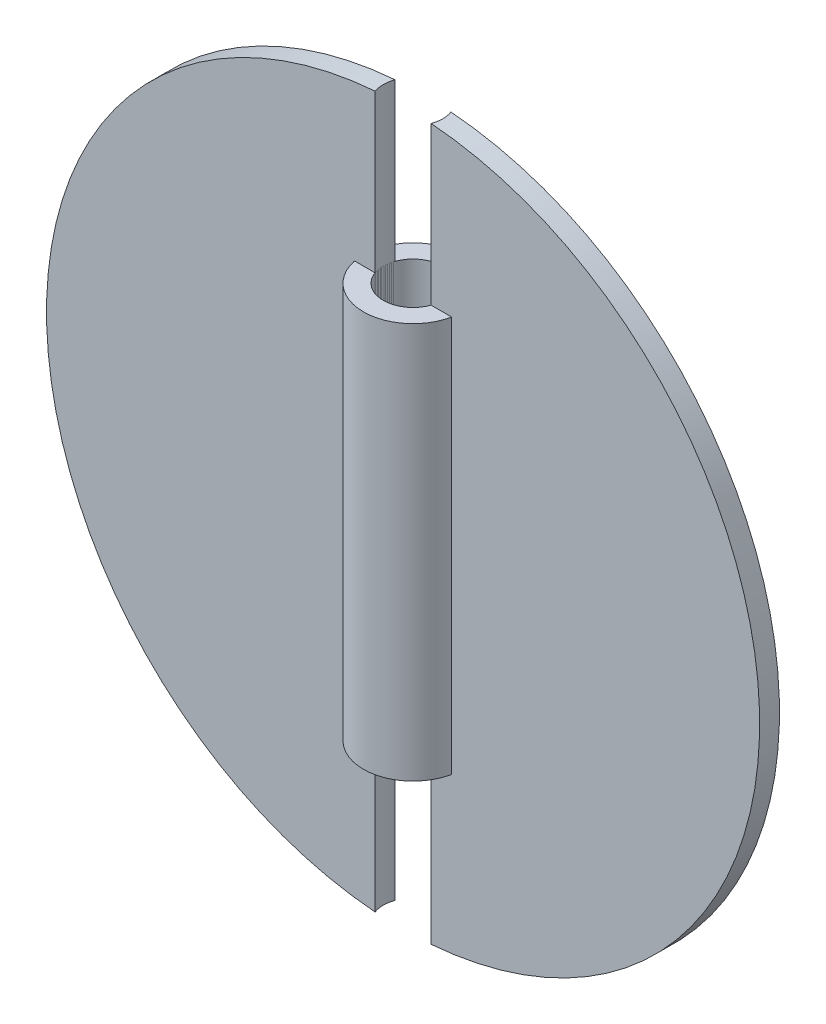
ISO-10303-21;
HEADER;
FILE_DESCRIPTION(('STEP AP214'),'2;1');
FILE_NAME('part.step','',(''),(''),'','','');
FILE_SCHEMA(('AUTOMOTIVE_DESIGN { 1 0 10303 214 1 1 1 1 }'));
ENDSEC;
DATA;
#1=APPLICATION_CONTEXT('core data for automotive mechanical design processes');
#2=APPLICATION_PROTOCOL_DEFINITION('international standard','automotive_design',2000,#1);
#3=PRODUCT_CONTEXT('',#1,'mechanical');
#4=PRODUCT('Part','Part','',(#3));
#5=PRODUCT_RELATED_PRODUCT_CATEGORY('part','',(#4));
#6=PRODUCT_DEFINITION_FORMATION('','',#4);
#7=PRODUCT_DEFINITION_CONTEXT('part definition',#1,'design');
#8=PRODUCT_DEFINITION('design','',#6,#7);
#9=PRODUCT_DEFINITION_SHAPE('','',#8);
#10=(LENGTH_UNIT() NAMED_UNIT(*) SI_UNIT(.MILLI.,.METRE.));
#11=(NAMED_UNIT(*) PLANE_ANGLE_UNIT() SI_UNIT($,.RADIAN.));
#12=(NAMED_UNIT(*) SI_UNIT($,.STERADIAN.) SOLID_ANGLE_UNIT());
#13=UNCERTAINTY_MEASURE_WITH_UNIT(LENGTH_MEASURE(1.E-05),#10,'distance_accuracy_value','');
#14=(GEOMETRIC_REPRESENTATION_CONTEXT(3) GLOBAL_UNCERTAINTY_ASSIGNED_CONTEXT((#13)) GLOBAL_UNIT_ASSIGNED_CONTEXT((#10,
#11,#12)) REPRESENTATION_CONTEXT('',''));
#15=CARTESIAN_POINT('',(0.,0.,0.));
#16=DIRECTION('',(0.,0.,1.));
#17=DIRECTION('',(1.,0.,0.));
#18=AXIS2_PLACEMENT_3D('',#15,#16,#17);
#19=CARTESIAN_POINT('',(0.,0.,2.));
#20=DIRECTION('',(0.,0.,-1.));
#21=DIRECTION('',(-1.,0.,0.));
#22=AXIS2_PLACEMENT_3D('',#19,#20,#21);
#23=CYLINDRICAL_SURFACE('',#22,36.);
#24=CARTESIAN_POINT('',(-2.82842712474619,-35.8887168898527,2.));
#25=CARTESIAN_POINT('',(-2.85685710321413,-35.8864742491253,1.91961725778914));
#26=CARTESIAN_POINT('',(-2.88184423251773,-35.8844729386396,1.83801039646096));
#27=CARTESIAN_POINT('',(-2.92478640735487,-35.8809995437341,1.67296300328552));
#28=CARTESIAN_POINT('',(-2.94274202966775,-35.8795274159074,1.58952262243114));
#29=CARTESIAN_POINT('',(-2.97107873749158,-35.8771916052031,1.42375391726264));
#30=CARTESIAN_POINT('',(-2.98165712639704,-35.8763120965818,1.34145949079588));
#31=CARTESIAN_POINT('',(-2.99596369777237,-35.8751202883122,1.1762752699752));
#32=CARTESIAN_POINT('',(-2.99969205131482,-35.8748079744986,1.0933854905415));
#33=CARTESIAN_POINT('',(-3.00027724030586,-35.8747590522023,0.925885201609564));
#34=CARTESIAN_POINT('',(-2.99699203862981,-35.8750343437651,0.841274157290855));
#35=CARTESIAN_POINT('',(-2.98328491449925,-35.8761767091872,0.67263165010222));
#36=CARTESIAN_POINT('',(-2.97286252929182,-35.8770438214184,0.58860022516988));
#37=CARTESIAN_POINT('',(-2.94454461758313,-35.8793795389662,0.419281579846612));
#38=CARTESIAN_POINT('',(-2.92643922061709,-35.8808650119824,0.334029627280769));
#39=CARTESIAN_POINT('',(-2.88289526145233,-35.884388648037,0.165426178952466));
#40=CARTESIAN_POINT('',(-2.8574562795393,-35.8864268427083,0.0820747922575321));
#41=CARTESIAN_POINT('',(-2.82842712474619,-35.8887168898527,0.));
#42=B_SPLINE_CURVE_WITH_KNOTS('',3,(#24,#25,#26,#27,#28,#29,#30,#31,#32,#33,#34,#35,#36,#37,#38,
#39,#40,#41),.UNSPECIFIED.,.F.,.F.,(4,2,2,2,2,2,2,2,4),(0.,0.255797873824147,0.511574760703559,
0.760217392738763,1.00885381509623,1.2625732725704,1.51630918198785,1.77747419008833,
2.0386541481021),.UNSPECIFIED.);
#43=CARTESIAN_POINT('',(-2.82842712474619,-35.8887168898527,2.));
#44=VERTEX_POINT('',#43);
#45=CARTESIAN_POINT('',(-2.82842712474619,-35.8887168898527,0.));
#46=VERTEX_POINT('',#45);
#47=EDGE_CURVE('E66',#44,#46,#42,.T.);
#48=ORIENTED_EDGE('',*,*,#47,.F.);
#49=CARTESIAN_POINT('',(0.,0.,2.));
#50=DIRECTION('',(0.,0.,1.));
#51=DIRECTION('',(1.,0.,0.));
#52=AXIS2_PLACEMENT_3D('',#49,#50,#51);
#53=CIRCLE('',#52,36.);
#54=CARTESIAN_POINT('',(-2.82842712474619,35.8887168898527,2.));
#55=VERTEX_POINT('',#54);
#56=EDGE_CURVE('E76',#55,#44,#53,.T.);
#57=ORIENTED_EDGE('',*,*,#56,.F.);
#58=CARTESIAN_POINT('',(-2.82842712474619,35.8887168898527,0.));
#59=CARTESIAN_POINT('',(-2.85685710321413,35.8864742491253,0.0803827422108638));
#60=CARTESIAN_POINT('',(-2.88184423251773,35.8844729386396,0.161989603539043));
#61=CARTESIAN_POINT('',(-2.92478640735487,35.8809995437341,0.327036996714481));
#62=CARTESIAN_POINT('',(-2.94274202966775,35.8795274159074,0.410477377568857));
#63=CARTESIAN_POINT('',(-2.97107873749158,35.8771916052031,0.576246082737364));
#64=CARTESIAN_POINT('',(-2.98165712639704,35.8763120965818,0.658540509204117));
#65=CARTESIAN_POINT('',(-2.99596369777237,35.8751202883122,0.823724730024802));
#66=CARTESIAN_POINT('',(-2.99969205131482,35.8748079744986,0.906614509458503));
#67=CARTESIAN_POINT('',(-3.00027724030586,35.8747590522023,1.07411479839044));
#68=CARTESIAN_POINT('',(-2.99699203862981,35.8750343437651,1.15872584270914));
#69=CARTESIAN_POINT('',(-2.98328491449925,35.8761767091872,1.32736834989778));
#70=CARTESIAN_POINT('',(-2.97286252929182,35.8770438214184,1.41139977483012));
#71=CARTESIAN_POINT('',(-2.94454461758313,35.8793795389662,1.58071842015339));
#72=CARTESIAN_POINT('',(-2.92643922061709,35.8808650119824,1.66597037271923));
#73=CARTESIAN_POINT('',(-2.88289526145233,35.884388648037,1.83457382104753));
#74=CARTESIAN_POINT('',(-2.8574562795393,35.8864268427083,1.91792520774247));
#75=CARTESIAN_POINT('',(-2.82842712474619,35.8887168898527,2.));
#76=B_SPLINE_CURVE_WITH_KNOTS('',3,(#58,#59,#60,#61,#62,#63,#64,#65,#66,#67,#68,#69,#70,#71,#72,
#73,#74,#75),.UNSPECIFIED.,.F.,.F.,(4,2,2,2,2,2,2,2,4),(0.,0.255797873824146,0.511574760703558,
0.760217392738762,1.00885381509623,1.2625732725704,1.51630918198785,1.77747419008833,
2.0386541481021),.UNSPECIFIED.);
#77=CARTESIAN_POINT('',(-2.82842712474619,35.8887168898527,0.));
#78=VERTEX_POINT('',#77);
#79=EDGE_CURVE('E12',#78,#55,#76,.T.);
#80=ORIENTED_EDGE('',*,*,#79,.F.);
#81=CARTESIAN_POINT('',(0.,0.,0.));
#82=DIRECTION('',(0.,0.,1.));
#83=DIRECTION('',(1.,0.,0.));
#84=AXIS2_PLACEMENT_3D('',#81,#82,#83);
#85=CIRCLE('',#84,36.);
#86=EDGE_CURVE('E47',#78,#46,#85,.T.);
#87=ORIENTED_EDGE('',*,*,#86,.T.);
#88=EDGE_LOOP('',(#48,#57,#80,#87));
#89=FACE_BOUND('',#88,.T.);
#90=ADVANCED_FACE('F42',(#89),#23,.T.);
#91=CARTESIAN_POINT('',(0.,0.,2.));
#92=DIRECTION('',(0.,0.,1.));
#93=DIRECTION('',(1.,0.,0.));
#94=AXIS2_PLACEMENT_3D('',#91,#92,#93);
#95=PLANE('',#94);
#96=ORIENTED_EDGE('',*,*,#56,.T.);
#97=DIRECTION('',(0.,-1.,0.));
#98=VECTOR('',#97,1.);
#99=CARTESIAN_POINT('',(-2.82842712474619,40.0001,2.));
#100=LINE('',#99,#98);
#101=EDGE_CURVE('E61',#44,#55,#100,.F.);
#102=ORIENTED_EDGE('',*,*,#101,.T.);
#103=EDGE_LOOP('',(#96,#102));
#104=FACE_BOUND('',#103,.T.);
#105=ADVANCED_FACE('F90',(#104),#95,.T.);
#106=CARTESIAN_POINT('',(0.,0.,0.));
#107=DIRECTION('',(0.,0.,1.));
#108=DIRECTION('',(1.,0.,0.));
#109=AXIS2_PLACEMENT_3D('',#106,#107,#108);
#110=PLANE('',#109);
#111=DIRECTION('',(0.,-1.,0.));
#112=VECTOR('',#111,1.);
#113=CARTESIAN_POINT('',(-2.82842712474619,40.0001,0.));
#114=LINE('',#113,#112);
#115=EDGE_CURVE('E53',#46,#78,#114,.F.);
#116=ORIENTED_EDGE('',*,*,#115,.F.);
#117=ORIENTED_EDGE('',*,*,#86,.F.);
#118=EDGE_LOOP('',(#116,#117));
#119=FACE_BOUND('',#118,.T.);
#120=ADVANCED_FACE('F77',(#119),#110,.F.);
#121=CARTESIAN_POINT('',(0.,40.0001,1.));
#122=DIRECTION('',(0.,-1.,0.));
#123=DIRECTION('',(0.,0.,-1.));
#124=AXIS2_PLACEMENT_3D('',#121,#122,#123);
#125=CYLINDRICAL_SURFACE('',#124,3.);
#126=ORIENTED_EDGE('',*,*,#47,.T.);
#127=ORIENTED_EDGE('',*,*,#115,.T.);
#128=ORIENTED_EDGE('',*,*,#79,.T.);
#129=ORIENTED_EDGE('',*,*,#101,.F.);
#130=EDGE_LOOP('',(#126,#127,#128,#129));
#131=FACE_BOUND('',#130,.T.);
#132=ADVANCED_FACE('F44',(#131),#125,.F.);
#133=CLOSED_SHELL('',(#90,#105,#120,#132));
#134=MANIFOLD_SOLID_BREP('B2',#133);
#135=CARTESIAN_POINT('',(0.,20.0001,1.));
#136=DIRECTION('',(0.,1.,0.));
#137=DIRECTION('',(0.,0.,1.));
#138=AXIS2_PLACEMENT_3D('',#135,#136,#137);
#139=PLANE('',#138);
#140=CARTESIAN_POINT('',(0.,20.0001,1.));
#141=DIRECTION('',(0.,1.,0.));
#142=DIRECTION('',(0.,0.,1.));
#143=AXIS2_PLACEMENT_3D('',#140,#141,#142);
#144=CIRCLE('',#143,5.);
#145=CARTESIAN_POINT('',(0.,20.0001,6.));
#146=VERTEX_POINT('',#145);
#147=EDGE_CURVE('E41',#146,#146,#144,.T.);
#148=ORIENTED_EDGE('',*,*,#147,.T.);
#149=EDGE_LOOP('',(#148));
#150=FACE_BOUND('',#149,.T.);
#151=CARTESIAN_POINT('',(0.,20.0001,1.));
#152=DIRECTION('',(0.,1.,0.));
#153=DIRECTION('',(0.,0.,1.));
#154=AXIS2_PLACEMENT_3D('',#151,#152,#153);
#155=CIRCLE('',#154,3.);
#156=CARTESIAN_POINT('',(0.,20.0001,4.));
#157=VERTEX_POINT('',#156);
#158=EDGE_CURVE('E140',#157,#157,#155,.T.);
#159=ORIENTED_EDGE('',*,*,#158,.F.);
#160=EDGE_LOOP('',(#159));
#161=FACE_BOUND('',#160,.T.);
#162=ADVANCED_FACE('F133',(#150,#161),#139,.T.);
#163=CARTESIAN_POINT('',(0.,20.0001,1.));
#164=DIRECTION('',(0.,-1.,0.));
#165=DIRECTION('',(0.,0.,-1.));
#166=AXIS2_PLACEMENT_3D('',#163,#164,#165);
#167=CYLINDRICAL_SURFACE('',#166,5.);
#168=ORIENTED_EDGE('',*,*,#147,.F.);
#169=EDGE_LOOP('',(#168));
#170=FACE_BOUND('',#169,.T.);
#171=CARTESIAN_POINT('',(0.,-20.,1.));
#172=DIRECTION('',(0.,1.,0.));
#173=DIRECTION('',(0.,0.,1.));
#174=AXIS2_PLACEMENT_3D('',#171,#172,#173);
#175=CIRCLE('',#174,5.);
#176=CARTESIAN_POINT('',(0.,-20.,6.));
#177=VERTEX_POINT('',#176);
#178=EDGE_CURVE('E144',#177,#177,#175,.T.);
#179=ORIENTED_EDGE('',*,*,#178,.T.);
#180=EDGE_LOOP('',(#179));
#181=FACE_BOUND('',#180,.T.);
#182=ADVANCED_FACE('F135',(#170,#181),#167,.T.);
#183=CARTESIAN_POINT('',(0.,20.0001,1.));
#184=DIRECTION('',(0.,-1.,0.));
#185=DIRECTION('',(0.,0.,-1.));
#186=AXIS2_PLACEMENT_3D('',#183,#184,#185);
#187=CYLINDRICAL_SURFACE('',#186,3.);
#188=ORIENTED_EDGE('',*,*,#158,.T.);
#189=EDGE_LOOP('',(#188));
#190=FACE_BOUND('',#189,.T.);
#191=CARTESIAN_POINT('',(0.,-20.,1.));
#192=DIRECTION('',(0.,1.,0.));
#193=DIRECTION('',(0.,0.,1.));
#194=AXIS2_PLACEMENT_3D('',#191,#192,#193);
#195=CIRCLE('',#194,3.);
#196=CARTESIAN_POINT('',(0.,-20.,4.));
#197=VERTEX_POINT('',#196);
#198=EDGE_CURVE('E148',#197,#197,#195,.T.);
#199=ORIENTED_EDGE('',*,*,#198,.F.);
#200=EDGE_LOOP('',(#199));
#201=FACE_BOUND('',#200,.T.);
#202=ADVANCED_FACE('F157',(#190,#201),#187,.F.);
#203=CARTESIAN_POINT('',(0.,-20.,1.));
#204=DIRECTION('',(0.,1.,0.));
#205=DIRECTION('',(0.,0.,1.));
#206=AXIS2_PLACEMENT_3D('',#203,#204,#205);
#207=PLANE('',#206);
#208=ORIENTED_EDGE('',*,*,#198,.T.);
#209=EDGE_LOOP('',(#208));
#210=FACE_BOUND('',#209,.T.);
#211=ORIENTED_EDGE('',*,*,#178,.F.);
#212=EDGE_LOOP('',(#211));
#213=FACE_BOUND('',#212,.T.);
#214=ADVANCED_FACE('F154',(#210,#213),#207,.F.);
#215=CLOSED_SHELL('',(#162,#182,#202,#214));
#216=MANIFOLD_SOLID_BREP('B6',#215);
#217=CARTESIAN_POINT('',(0.,0.,0.));
#218=DIRECTION('',(0.,0.,1.));
#219=DIRECTION('',(1.,0.,0.));
#220=AXIS2_PLACEMENT_3D('',#217,#218,#219);
#221=PLANE('',#220);
#222=DIRECTION('',(0.,-1.,0.));
#223=VECTOR('',#222,1.);
#224=CARTESIAN_POINT('',(2.82842712474619,40.0001,0.));
#225=LINE('',#224,#223);
#226=CARTESIAN_POINT('',(2.82842712474619,35.8887168898527,0.));
#227=VERTEX_POINT('',#226);
#228=CARTESIAN_POINT('',(2.82842712474619,-35.8887168898527,0.));
#229=VERTEX_POINT('',#228);
#230=EDGE_CURVE('E131',#227,#229,#225,.T.);
#231=ORIENTED_EDGE('',*,*,#230,.F.);
#232=CARTESIAN_POINT('',(0.,0.,0.));
#233=DIRECTION('',(0.,0.,1.));
#234=DIRECTION('',(1.,0.,0.));
#235=AXIS2_PLACEMENT_3D('',#232,#233,#234);
#236=CIRCLE('',#235,36.);
#237=EDGE_CURVE('E227',#229,#227,#236,.T.);
#238=ORIENTED_EDGE('',*,*,#237,.F.);
#239=EDGE_LOOP('',(#231,#238));
#240=FACE_BOUND('',#239,.T.);
#241=ADVANCED_FACE('F195',(#240),#221,.F.);
#242=CARTESIAN_POINT('',(0.,0.,2.));
#243=DIRECTION('',(0.,0.,1.));
#244=DIRECTION('',(1.,0.,0.));
#245=AXIS2_PLACEMENT_3D('',#242,#243,#244);
#246=PLANE('',#245);
#247=CARTESIAN_POINT('',(0.,0.,2.));
#248=DIRECTION('',(0.,0.,1.));
#249=DIRECTION('',(1.,0.,0.));
#250=AXIS2_PLACEMENT_3D('',#247,#248,#249);
#251=CIRCLE('',#250,36.);
#252=CARTESIAN_POINT('',(2.82842712474619,-35.8887168898527,2.));
#253=VERTEX_POINT('',#252);
#254=CARTESIAN_POINT('',(2.82842712474619,35.8887168898527,2.));
#255=VERTEX_POINT('',#254);
#256=EDGE_CURVE('E204',#253,#255,#251,.T.);
#257=ORIENTED_EDGE('',*,*,#256,.T.);
#258=DIRECTION('',(0.,-1.,0.));
#259=VECTOR('',#258,1.);
#260=CARTESIAN_POINT('',(2.82842712474619,40.0001,2.));
#261=LINE('',#260,#259);
#262=EDGE_CURVE('E215',#255,#253,#261,.T.);
#263=ORIENTED_EDGE('',*,*,#262,.T.);
#264=EDGE_LOOP('',(#257,#263));
#265=FACE_BOUND('',#264,.T.);
#266=ADVANCED_FACE('F243',(#265),#246,.T.);
#267=CARTESIAN_POINT('',(0.,0.,2.));
#268=DIRECTION('',(0.,0.,-1.));
#269=DIRECTION('',(-1.,0.,0.));
#270=AXIS2_PLACEMENT_3D('',#267,#268,#269);
#271=CYLINDRICAL_SURFACE('',#270,36.);
#272=CARTESIAN_POINT('',(2.82842712474619,35.8887168898527,2.));
#273=CARTESIAN_POINT('',(2.85685710321413,35.8864742491253,1.91961725778914));
#274=CARTESIAN_POINT('',(2.88184423251773,35.8844729386396,1.83801039646096));
#275=CARTESIAN_POINT('',(2.92478640735487,35.8809995437341,1.67296300328552));
#276=CARTESIAN_POINT('',(2.94274202966775,35.8795274159074,1.58952262243114));
#277=CARTESIAN_POINT('',(2.97107873749158,35.8771916052031,1.42375391726264));
#278=CARTESIAN_POINT('',(2.98165712639704,35.8763120965818,1.34145949079588));
#279=CARTESIAN_POINT('',(2.99596369777237,35.8751202883122,1.1762752699752));
#280=CARTESIAN_POINT('',(2.99969205131482,35.8748079744986,1.0933854905415));
#281=CARTESIAN_POINT('',(3.00027724030586,35.8747590522023,0.925885201609564));
#282=CARTESIAN_POINT('',(2.99699203862981,35.8750343437651,0.841274157290855));
#283=CARTESIAN_POINT('',(2.98328491449925,35.8761767091872,0.67263165010222));
#284=CARTESIAN_POINT('',(2.97286252929182,35.8770438214184,0.58860022516988));
#285=CARTESIAN_POINT('',(2.94454461758313,35.8793795389662,0.419281579846612));
#286=CARTESIAN_POINT('',(2.92643922061709,35.8808650119824,0.334029627280769));
#287=CARTESIAN_POINT('',(2.88289526145233,35.884388648037,0.165426178952466));
#288=CARTESIAN_POINT('',(2.8574562795393,35.8864268427083,0.0820747922575321));
#289=CARTESIAN_POINT('',(2.82842712474619,35.8887168898527,0.));
#290=B_SPLINE_CURVE_WITH_KNOTS('',3,(#272,#273,#274,#275,#276,#277,#278,#279,#280,#281,#282,
#283,#284,#285,#286,#287,#288,#289),.UNSPECIFIED.,.F.,.F.,(4,2,2,2,2,2,2,2,4),(0.,
0.255797873824147,0.511574760703559,0.760217392738763,1.00885381509623,1.2625732725704,
1.51630918198785,1.77747419008833,2.0386541481021),.UNSPECIFIED.);
#291=EDGE_CURVE('E210',#255,#227,#290,.T.);
#292=ORIENTED_EDGE('',*,*,#291,.F.);
#293=ORIENTED_EDGE('',*,*,#256,.F.);
#294=CARTESIAN_POINT('',(2.82842712474619,-35.8887168898527,0.));
#295=CARTESIAN_POINT('',(2.85685710321413,-35.8864742491253,0.0803827422108638));
#296=CARTESIAN_POINT('',(2.88184423251773,-35.8844729386396,0.161989603539043));
#297=CARTESIAN_POINT('',(2.92478640735487,-35.8809995437341,0.327036996714481));
#298=CARTESIAN_POINT('',(2.94274202966775,-35.8795274159074,0.410477377568857));
#299=CARTESIAN_POINT('',(2.97107873749158,-35.8771916052031,0.576246082737364));
#300=CARTESIAN_POINT('',(2.98165712639704,-35.8763120965818,0.658540509204117));
#301=CARTESIAN_POINT('',(2.99596369777237,-35.8751202883122,0.823724730024802));
#302=CARTESIAN_POINT('',(2.99969205131482,-35.8748079744986,0.906614509458503));
#303=CARTESIAN_POINT('',(3.00027724030586,-35.8747590522023,1.07411479839044));
#304=CARTESIAN_POINT('',(2.99699203862981,-35.8750343437651,1.15872584270914));
#305=CARTESIAN_POINT('',(2.98328491449925,-35.8761767091872,1.32736834989778));
#306=CARTESIAN_POINT('',(2.97286252929182,-35.8770438214184,1.41139977483012));
#307=CARTESIAN_POINT('',(2.94454461758313,-35.8793795389662,1.58071842015339));
#308=CARTESIAN_POINT('',(2.92643922061709,-35.8808650119824,1.66597037271923));
#309=CARTESIAN_POINT('',(2.88289526145233,-35.884388648037,1.83457382104753));
#310=CARTESIAN_POINT('',(2.8574562795393,-35.8864268427083,1.91792520774247));
#311=CARTESIAN_POINT('',(2.82842712474619,-35.8887168898527,2.));
#312=B_SPLINE_CURVE_WITH_KNOTS('',3,(#294,#295,#296,#297,#298,#299,#300,#301,#302,#303,#304,
#305,#306,#307,#308,#309,#310,#311),.UNSPECIFIED.,.F.,.F.,(4,2,2,2,2,2,2,2,4),(0.,
0.255797873824146,0.511574760703558,0.760217392738762,1.00885381509623,1.2625732725704,
1.51630918198785,1.77747419008833,2.0386541481021),.UNSPECIFIED.);
#313=EDGE_CURVE('E221',#229,#253,#312,.T.);
#314=ORIENTED_EDGE('',*,*,#313,.F.);
#315=ORIENTED_EDGE('',*,*,#237,.T.);
#316=EDGE_LOOP('',(#292,#293,#314,#315));
#317=FACE_BOUND('',#316,.T.);
#318=ADVANCED_FACE('F197',(#317),#271,.T.);
#319=CARTESIAN_POINT('',(0.,40.0001,1.));
#320=DIRECTION('',(0.,-1.,0.));
#321=DIRECTION('',(0.,0.,-1.));
#322=AXIS2_PLACEMENT_3D('',#319,#320,#321);
#323=CYLINDRICAL_SURFACE('',#322,3.);
#324=ORIENTED_EDGE('',*,*,#291,.T.);
#325=ORIENTED_EDGE('',*,*,#230,.T.);
#326=ORIENTED_EDGE('',*,*,#313,.T.);
#327=ORIENTED_EDGE('',*,*,#262,.F.);
#328=EDGE_LOOP('',(#324,#325,#326,#327));
#329=FACE_BOUND('',#328,.T.);
#330=ADVANCED_FACE('F220',(#329),#323,.F.);
#331=CLOSED_SHELL('',(#241,#266,#318,#330));
#332=MANIFOLD_SOLID_BREP('B36',#331);
#333=ADVANCED_BREP_SHAPE_REPRESENTATION('',(#18,#134,#216,#332),#14);
#334=SHAPE_DEFINITION_REPRESENTATION(#9,#333);
ENDSEC;
END-ISO-10303-21;
